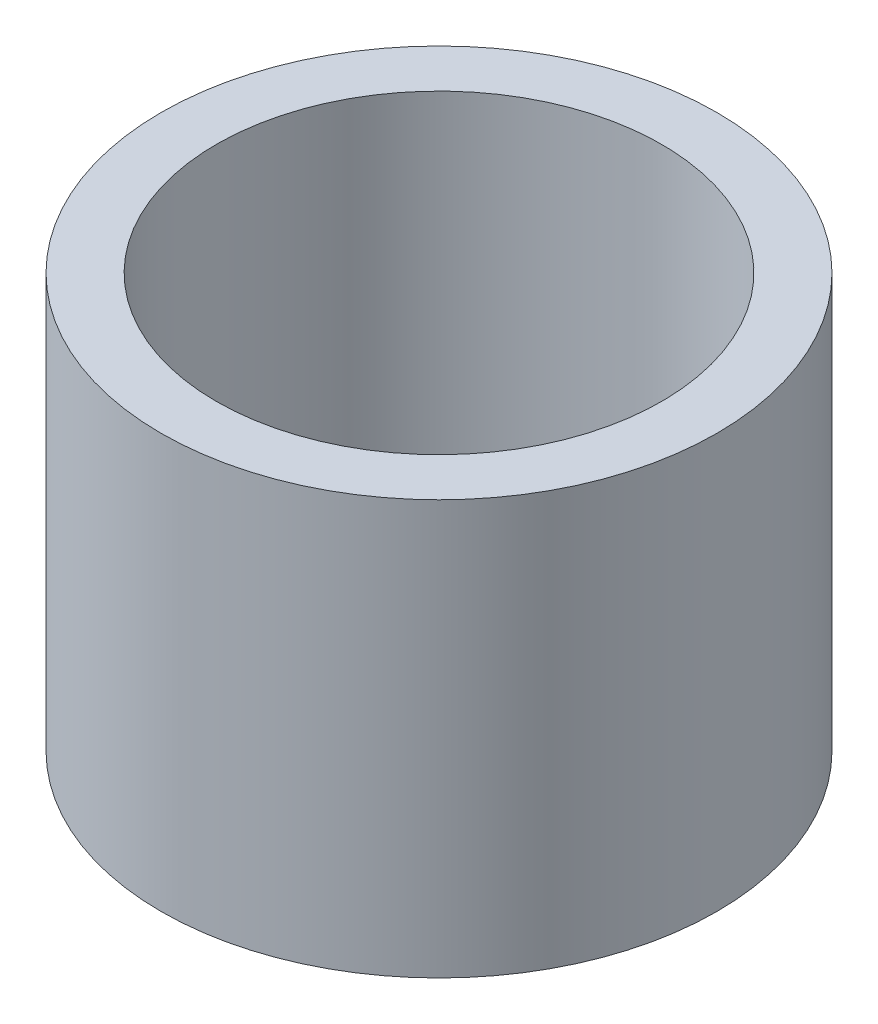
ISO-10303-21;
HEADER;
FILE_DESCRIPTION(('STEP AP214'),'2;1');
FILE_NAME('part.step','',(''),(''),'','','');
FILE_SCHEMA(('AUTOMOTIVE_DESIGN { 1 0 10303 214 1 1 1 1 }'));
ENDSEC;
DATA;
#1=APPLICATION_CONTEXT('core data for automotive mechanical design processes');
#2=APPLICATION_PROTOCOL_DEFINITION('international standard','automotive_design',2000,#1);
#3=PRODUCT_CONTEXT('',#1,'mechanical');
#4=PRODUCT('Part','Part','',(#3));
#5=PRODUCT_RELATED_PRODUCT_CATEGORY('part','',(#4));
#6=PRODUCT_DEFINITION_FORMATION('','',#4);
#7=PRODUCT_DEFINITION_CONTEXT('part definition',#1,'design');
#8=PRODUCT_DEFINITION('design','',#6,#7);
#9=PRODUCT_DEFINITION_SHAPE('','',#8);
#10=(LENGTH_UNIT() NAMED_UNIT(*) SI_UNIT(.MILLI.,.METRE.));
#11=(NAMED_UNIT(*) PLANE_ANGLE_UNIT() SI_UNIT($,.RADIAN.));
#12=(NAMED_UNIT(*) SI_UNIT($,.STERADIAN.) SOLID_ANGLE_UNIT());
#13=UNCERTAINTY_MEASURE_WITH_UNIT(LENGTH_MEASURE(1.E-05),#10,'distance_accuracy_value','');
#14=(GEOMETRIC_REPRESENTATION_CONTEXT(3) GLOBAL_UNCERTAINTY_ASSIGNED_CONTEXT((#13)) GLOBAL_UNIT_ASSIGNED_CONTEXT((#10,
#11,#12)) REPRESENTATION_CONTEXT('',''));
#15=CARTESIAN_POINT('',(0.,0.,0.));
#16=DIRECTION('',(0.,0.,1.));
#17=DIRECTION('',(1.,0.,0.));
#18=AXIS2_PLACEMENT_3D('',#15,#16,#17);
#19=CARTESIAN_POINT('',(0.,-76.2,0.));
#20=DIRECTION('',(0.,1.,0.));
#21=DIRECTION('',(0.,0.,1.));
#22=AXIS2_PLACEMENT_3D('',#19,#20,#21);
#23=CYLINDRICAL_SURFACE('',#22,51.1302);
#24=CARTESIAN_POINT('',(0.,-76.2,0.));
#25=DIRECTION('',(0.,1.,0.));
#26=DIRECTION('',(0.,0.,1.));
#27=AXIS2_PLACEMENT_3D('',#24,#25,#26);
#28=CIRCLE('',#27,51.1302);
#29=CARTESIAN_POINT('',(0.,-76.2,51.1302));
#30=VERTEX_POINT('',#29);
#31=EDGE_CURVE('E10',#30,#30,#28,.T.);
#32=CARTESIAN_POINT('',(0.,0.,0.));
#33=DIRECTION('',(0.,1.,0.));
#34=DIRECTION('',(0.,0.,1.));
#35=AXIS2_PLACEMENT_3D('',#32,#33,#34);
#36=CIRCLE('',#35,51.1302);
#37=CARTESIAN_POINT('',(0.,0.,51.1302));
#38=VERTEX_POINT('',#37);
#39=EDGE_CURVE('E36',#38,#38,#36,.T.);
#40=CARTESIAN_POINT('',(0.,-76.2,51.1302));
#41=CARTESIAN_POINT('',(0.,-75.40625,51.1302));
#42=CARTESIAN_POINT('',(0.,-74.6125,51.1302));
#43=CARTESIAN_POINT('',(0.,-73.025,51.1302));
#44=CARTESIAN_POINT('',(0.,-72.23125,51.1302));
#45=CARTESIAN_POINT('',(0.,-70.64375,51.1302));
#46=CARTESIAN_POINT('',(0.,-69.85,51.1302));
#47=CARTESIAN_POINT('',(0.,-68.2625,51.1302));
#48=CARTESIAN_POINT('',(0.,-67.46875,51.1302));
#49=CARTESIAN_POINT('',(0.,-65.88125,51.1302));
#50=CARTESIAN_POINT('',(0.,-65.0875,51.1302));
#51=CARTESIAN_POINT('',(0.,-63.5,51.1302));
#52=CARTESIAN_POINT('',(0.,-62.70625,51.1302));
#53=CARTESIAN_POINT('',(0.,-61.11875,51.1302));
#54=CARTESIAN_POINT('',(0.,-60.325,51.1302));
#55=CARTESIAN_POINT('',(0.,-58.7375,51.1302));
#56=CARTESIAN_POINT('',(0.,-57.94375,51.1302));
#57=CARTESIAN_POINT('',(0.,-56.35625,51.1302));
#58=CARTESIAN_POINT('',(0.,-55.5625,51.1302));
#59=CARTESIAN_POINT('',(0.,-53.975,51.1302));
#60=CARTESIAN_POINT('',(0.,-53.18125,51.1302));
#61=CARTESIAN_POINT('',(0.,-51.59375,51.1302));
#62=CARTESIAN_POINT('',(0.,-50.8,51.1302));
#63=CARTESIAN_POINT('',(0.,-49.2125,51.1302));
#64=CARTESIAN_POINT('',(0.,-48.41875,51.1302));
#65=CARTESIAN_POINT('',(0.,-46.83125,51.1302));
#66=CARTESIAN_POINT('',(0.,-46.0375,51.1302));
#67=CARTESIAN_POINT('',(0.,-44.45,51.1302));
#68=CARTESIAN_POINT('',(0.,-43.65625,51.1302));
#69=CARTESIAN_POINT('',(0.,-42.06875,51.1302));
#70=CARTESIAN_POINT('',(0.,-41.275,51.1302));
#71=CARTESIAN_POINT('',(0.,-39.6875,51.1302));
#72=CARTESIAN_POINT('',(0.,-38.89375,51.1302));
#73=CARTESIAN_POINT('',(0.,-37.30625,51.1302));
#74=CARTESIAN_POINT('',(0.,-36.5125,51.1302));
#75=CARTESIAN_POINT('',(0.,-34.925,51.1302));
#76=CARTESIAN_POINT('',(0.,-34.13125,51.1302));
#77=CARTESIAN_POINT('',(0.,-32.54375,51.1302));
#78=CARTESIAN_POINT('',(0.,-31.75,51.1302));
#79=CARTESIAN_POINT('',(0.,-30.1625,51.1302));
#80=CARTESIAN_POINT('',(0.,-29.36875,51.1302));
#81=CARTESIAN_POINT('',(0.,-27.78125,51.1302));
#82=CARTESIAN_POINT('',(0.,-26.9875,51.1302));
#83=CARTESIAN_POINT('',(0.,-25.4,51.1302));
#84=CARTESIAN_POINT('',(0.,-24.60625,51.1302));
#85=CARTESIAN_POINT('',(0.,-23.01875,51.1302));
#86=CARTESIAN_POINT('',(0.,-22.225,51.1302));
#87=CARTESIAN_POINT('',(0.,-20.6375,51.1302));
#88=CARTESIAN_POINT('',(0.,-19.84375,51.1302));
#89=CARTESIAN_POINT('',(0.,-18.25625,51.1302));
#90=CARTESIAN_POINT('',(0.,-17.4625,51.1302));
#91=CARTESIAN_POINT('',(0.,-15.875,51.1302));
#92=CARTESIAN_POINT('',(0.,-15.08125,51.1302));
#93=CARTESIAN_POINT('',(0.,-13.49375,51.1302));
#94=CARTESIAN_POINT('',(0.,-12.7,51.1302));
#95=CARTESIAN_POINT('',(0.,-11.1125,51.1302));
#96=CARTESIAN_POINT('',(0.,-10.31875,51.1302));
#97=CARTESIAN_POINT('',(0.,-8.73125,51.1302));
#98=CARTESIAN_POINT('',(0.,-7.93750000000001,51.1302));
#99=CARTESIAN_POINT('',(0.,-6.35,51.1302));
#100=CARTESIAN_POINT('',(0.,-5.55625,51.1302));
#101=CARTESIAN_POINT('',(0.,-3.96875,51.1302));
#102=CARTESIAN_POINT('',(0.,-3.175,51.1302));
#103=CARTESIAN_POINT('',(0.,-1.5875,51.1302));
#104=CARTESIAN_POINT('',(0.,-0.793750000000001,51.1302));
#105=CARTESIAN_POINT('',(0.,0.,51.1302));
#106=B_SPLINE_CURVE_WITH_KNOTS('',3,(#40,#41,#42,#43,#44,#45,#46,#47,#48,#49,#50,#51,#52,#53,
#54,#55,#56,#57,#58,#59,#60,#61,#62,#63,#64,#65,#66,#67,#68,#69,#70,#71,#72,#73,#74,#75,#76,#77,
#78,#79,#80,#81,#82,#83,#84,#85,#86,#87,#88,#89,#90,#91,#92,#93,#94,#95,#96,#97,#98,#99,#100,
#101,#102,#103,#104,#105),.UNSPECIFIED.,.F.,.F.,(4,2,2,2,2,2,2,2,2,2,2,2,2,2,2,2,2,2,2,2,2,2,2,
2,2,2,2,2,2,2,2,2,4),(0.,2.38125,4.7625,7.14375,9.52500000000001,11.90625,14.2875,16.66875,
19.05,21.43125,23.8125,26.19375,28.575,30.95625,33.3375,35.71875,38.1,40.48125,42.8625,45.24375,
47.625,50.00625,52.3875,54.76875,57.15,59.53125,61.9125,64.29375,66.675,69.05625,71.4375,
73.81875,76.2),.UNSPECIFIED.);
#107=EDGE_CURVE('BSEAM33',#30,#38,#106,.T.);
#108=ORIENTED_EDGE('',*,*,#31,.T.);
#109=ORIENTED_EDGE('',*,*,#39,.F.);
#110=ORIENTED_EDGE('',*,*,#107,.T.);
#111=ORIENTED_EDGE('',*,*,#107,.F.);
#112=EDGE_LOOP('',(#108,#110,#109,#111));
#113=FACE_BOUND('',#112,.T.);
#114=ADVANCED_FACE('F33',(#113),#23,.T.);
#115=CARTESIAN_POINT('',(0.,-76.2,0.));
#116=DIRECTION('',(0.,1.,0.));
#117=DIRECTION('',(0.,0.,1.));
#118=AXIS2_PLACEMENT_3D('',#115,#116,#117);
#119=PLANE('',#118);
#120=CARTESIAN_POINT('',(0.,-76.2,0.));
#121=DIRECTION('',(0.,1.,0.));
#122=DIRECTION('',(0.,0.,1.));
#123=AXIS2_PLACEMENT_3D('',#120,#121,#122);
#124=CIRCLE('',#123,40.9702);
#125=CARTESIAN_POINT('',(0.,-76.2,40.9702));
#126=VERTEX_POINT('',#125);
#127=EDGE_CURVE('E43',#126,#126,#124,.T.);
#128=ORIENTED_EDGE('',*,*,#127,.T.);
#129=EDGE_LOOP('',(#128));
#130=FACE_BOUND('',#129,.T.);
#131=ORIENTED_EDGE('',*,*,#31,.F.);
#132=EDGE_LOOP('',(#131));
#133=FACE_BOUND('',#132,.T.);
#134=ADVANCED_FACE('F51',(#130,#133),#119,.F.);
#135=CARTESIAN_POINT('',(0.,0.,0.));
#136=DIRECTION('',(0.,1.,0.));
#137=DIRECTION('',(0.,0.,1.));
#138=AXIS2_PLACEMENT_3D('',#135,#136,#137);
#139=PLANE('',#138);
#140=CARTESIAN_POINT('',(0.,0.,0.));
#141=DIRECTION('',(0.,1.,0.));
#142=DIRECTION('',(0.,0.,1.));
#143=AXIS2_PLACEMENT_3D('',#140,#141,#142);
#144=CIRCLE('',#143,40.9702);
#145=CARTESIAN_POINT('',(0.,0.,40.9702));
#146=VERTEX_POINT('',#145);
#147=EDGE_CURVE('E45',#146,#146,#144,.T.);
#148=ORIENTED_EDGE('',*,*,#147,.F.);
#149=EDGE_LOOP('',(#148));
#150=FACE_BOUND('',#149,.T.);
#151=ORIENTED_EDGE('',*,*,#39,.T.);
#152=EDGE_LOOP('',(#151));
#153=FACE_BOUND('',#152,.T.);
#154=ADVANCED_FACE('F57',(#150,#153),#139,.T.);
#155=CARTESIAN_POINT('',(0.,-76.2,0.));
#156=DIRECTION('',(0.,1.,0.));
#157=DIRECTION('',(0.,0.,1.));
#158=AXIS2_PLACEMENT_3D('',#155,#156,#157);
#159=CYLINDRICAL_SURFACE('',#158,40.9702);
#160=CARTESIAN_POINT('',(0.,-76.2,40.9702));
#161=CARTESIAN_POINT('',(0.,-75.40625,40.9702));
#162=CARTESIAN_POINT('',(0.,-74.6125,40.9702));
#163=CARTESIAN_POINT('',(0.,-73.025,40.9702));
#164=CARTESIAN_POINT('',(0.,-72.23125,40.9702));
#165=CARTESIAN_POINT('',(0.,-70.64375,40.9702));
#166=CARTESIAN_POINT('',(0.,-69.85,40.9702));
#167=CARTESIAN_POINT('',(0.,-68.2625,40.9702));
#168=CARTESIAN_POINT('',(0.,-67.46875,40.9702));
#169=CARTESIAN_POINT('',(0.,-65.88125,40.9702));
#170=CARTESIAN_POINT('',(0.,-65.0875,40.9702));
#171=CARTESIAN_POINT('',(0.,-63.5,40.9702));
#172=CARTESIAN_POINT('',(0.,-62.70625,40.9702));
#173=CARTESIAN_POINT('',(0.,-61.11875,40.9702));
#174=CARTESIAN_POINT('',(0.,-60.325,40.9702));
#175=CARTESIAN_POINT('',(0.,-58.7375,40.9702));
#176=CARTESIAN_POINT('',(0.,-57.94375,40.9702));
#177=CARTESIAN_POINT('',(0.,-56.35625,40.9702));
#178=CARTESIAN_POINT('',(0.,-55.5625,40.9702));
#179=CARTESIAN_POINT('',(0.,-53.975,40.9702));
#180=CARTESIAN_POINT('',(0.,-53.18125,40.9702));
#181=CARTESIAN_POINT('',(0.,-51.59375,40.9702));
#182=CARTESIAN_POINT('',(0.,-50.8,40.9702));
#183=CARTESIAN_POINT('',(0.,-49.2125,40.9702));
#184=CARTESIAN_POINT('',(0.,-48.41875,40.9702));
#185=CARTESIAN_POINT('',(0.,-46.83125,40.9702));
#186=CARTESIAN_POINT('',(0.,-46.0375,40.9702));
#187=CARTESIAN_POINT('',(0.,-44.45,40.9702));
#188=CARTESIAN_POINT('',(0.,-43.65625,40.9702));
#189=CARTESIAN_POINT('',(0.,-42.06875,40.9702));
#190=CARTESIAN_POINT('',(0.,-41.275,40.9702));
#191=CARTESIAN_POINT('',(0.,-39.6875,40.9702));
#192=CARTESIAN_POINT('',(0.,-38.89375,40.9702));
#193=CARTESIAN_POINT('',(0.,-37.30625,40.9702));
#194=CARTESIAN_POINT('',(0.,-36.5125,40.9702));
#195=CARTESIAN_POINT('',(0.,-34.925,40.9702));
#196=CARTESIAN_POINT('',(0.,-34.13125,40.9702));
#197=CARTESIAN_POINT('',(0.,-32.54375,40.9702));
#198=CARTESIAN_POINT('',(0.,-31.75,40.9702));
#199=CARTESIAN_POINT('',(0.,-30.1625,40.9702));
#200=CARTESIAN_POINT('',(0.,-29.36875,40.9702));
#201=CARTESIAN_POINT('',(0.,-27.78125,40.9702));
#202=CARTESIAN_POINT('',(0.,-26.9875,40.9702));
#203=CARTESIAN_POINT('',(0.,-25.4,40.9702));
#204=CARTESIAN_POINT('',(0.,-24.60625,40.9702));
#205=CARTESIAN_POINT('',(0.,-23.01875,40.9702));
#206=CARTESIAN_POINT('',(0.,-22.225,40.9702));
#207=CARTESIAN_POINT('',(0.,-20.6375,40.9702));
#208=CARTESIAN_POINT('',(0.,-19.84375,40.9702));
#209=CARTESIAN_POINT('',(0.,-18.25625,40.9702));
#210=CARTESIAN_POINT('',(0.,-17.4625,40.9702));
#211=CARTESIAN_POINT('',(0.,-15.875,40.9702));
#212=CARTESIAN_POINT('',(0.,-15.08125,40.9702));
#213=CARTESIAN_POINT('',(0.,-13.49375,40.9702));
#214=CARTESIAN_POINT('',(0.,-12.7,40.9702));
#215=CARTESIAN_POINT('',(0.,-11.1125,40.9702));
#216=CARTESIAN_POINT('',(0.,-10.31875,40.9702));
#217=CARTESIAN_POINT('',(0.,-8.73125,40.9702));
#218=CARTESIAN_POINT('',(0.,-7.93750000000001,40.9702));
#219=CARTESIAN_POINT('',(0.,-6.35,40.9702));
#220=CARTESIAN_POINT('',(0.,-5.55625,40.9702));
#221=CARTESIAN_POINT('',(0.,-3.96875,40.9702));
#222=CARTESIAN_POINT('',(0.,-3.175,40.9702));
#223=CARTESIAN_POINT('',(0.,-1.5875,40.9702));
#224=CARTESIAN_POINT('',(0.,-0.793750000000001,40.9702));
#225=CARTESIAN_POINT('',(0.,0.,40.9702));
#226=B_SPLINE_CURVE_WITH_KNOTS('',3,(#160,#161,#162,#163,#164,#165,#166,#167,#168,#169,#170,
#171,#172,#173,#174,#175,#176,#177,#178,#179,#180,#181,#182,#183,#184,#185,#186,#187,#188,#189,
#190,#191,#192,#193,#194,#195,#196,#197,#198,#199,#200,#201,#202,#203,#204,#205,#206,#207,#208,
#209,#210,#211,#212,#213,#214,#215,#216,#217,#218,#219,#220,#221,#222,#223,#224,#225),
.UNSPECIFIED.,.F.,.F.,(4,2,2,2,2,2,2,2,2,2,2,2,2,2,2,2,2,2,2,2,2,2,2,2,2,2,2,2,2,2,2,2,4),(0.,
2.38124999999999,4.76249999999999,7.14374999999999,9.52499999999999,11.90625,14.2875,16.66875,
19.05,21.43125,23.8125,26.19375,28.575,30.95625,33.3375,35.71875,38.1,40.48125,42.8625,45.24375,
47.625,50.00625,52.3875,54.76875,57.15,59.53125,61.9125,64.29375,66.675,69.05625,71.4375,
73.81875,76.2),.UNSPECIFIED.);
#227=EDGE_CURVE('BSEAM54',#126,#146,#226,.T.);
#228=ORIENTED_EDGE('',*,*,#127,.F.);
#229=ORIENTED_EDGE('',*,*,#147,.T.);
#230=ORIENTED_EDGE('',*,*,#227,.T.);
#231=ORIENTED_EDGE('',*,*,#227,.F.);
#232=EDGE_LOOP('',(#228,#230,#229,#231));
#233=FACE_BOUND('',#232,.T.);
#234=ADVANCED_FACE('F54',(#233),#159,.F.);
#235=CLOSED_SHELL('',(#114,#134,#154,#234));
#236=MANIFOLD_SOLID_BREP('B2',#235);
#237=ADVANCED_BREP_SHAPE_REPRESENTATION('',(#18,#236),#14);
#238=SHAPE_DEFINITION_REPRESENTATION(#9,#237);
ENDSEC;
END-ISO-10303-21;
